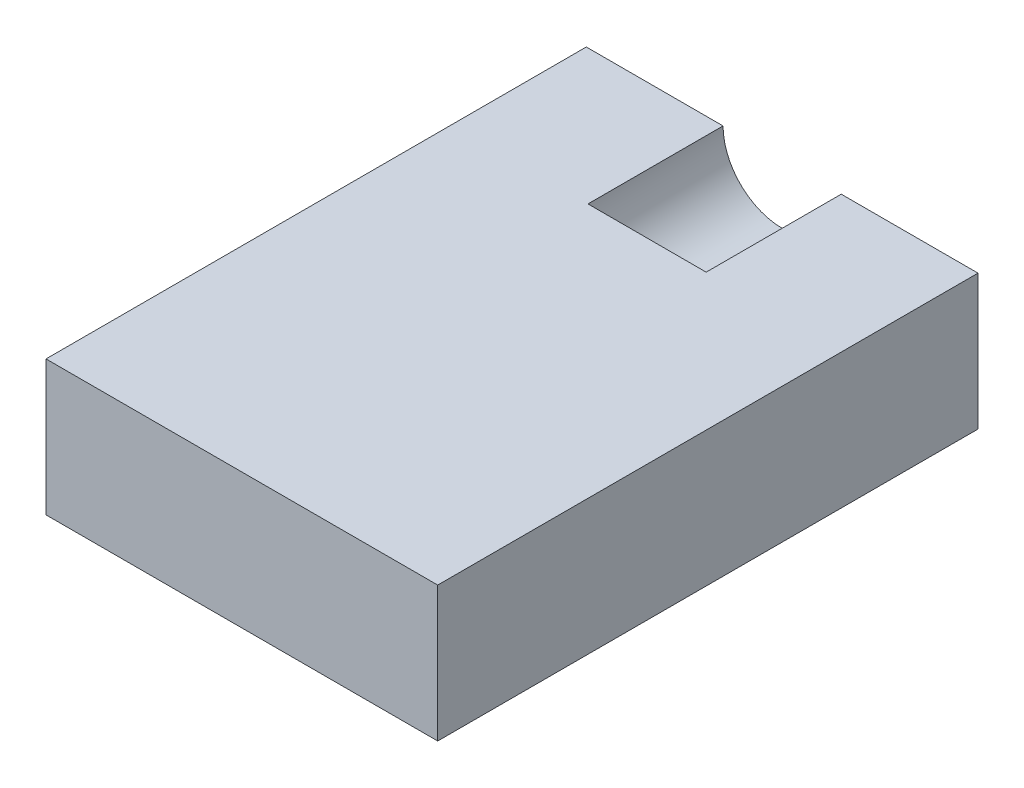
ISO-10303-21;
HEADER;
FILE_DESCRIPTION(('STEP AP214'),'2;1');
FILE_NAME('part.step','',(''),(''),'','','');
FILE_SCHEMA(('AUTOMOTIVE_DESIGN { 1 0 10303 214 1 1 1 1 }'));
ENDSEC;
DATA;
#1=APPLICATION_CONTEXT('core data for automotive mechanical design processes');
#2=APPLICATION_PROTOCOL_DEFINITION('international standard','automotive_design',2000,#1);
#3=PRODUCT_CONTEXT('',#1,'mechanical');
#4=PRODUCT('Part','Part','',(#3));
#5=PRODUCT_RELATED_PRODUCT_CATEGORY('part','',(#4));
#6=PRODUCT_DEFINITION_FORMATION('','',#4);
#7=PRODUCT_DEFINITION_CONTEXT('part definition',#1,'design');
#8=PRODUCT_DEFINITION('design','',#6,#7);
#9=PRODUCT_DEFINITION_SHAPE('','',#8);
#10=(LENGTH_UNIT() NAMED_UNIT(*) SI_UNIT(.MILLI.,.METRE.));
#11=(NAMED_UNIT(*) PLANE_ANGLE_UNIT() SI_UNIT($,.RADIAN.));
#12=(NAMED_UNIT(*) SI_UNIT($,.STERADIAN.) SOLID_ANGLE_UNIT());
#13=UNCERTAINTY_MEASURE_WITH_UNIT(LENGTH_MEASURE(1.E-05),#10,'distance_accuracy_value','');
#14=(GEOMETRIC_REPRESENTATION_CONTEXT(3) GLOBAL_UNCERTAINTY_ASSIGNED_CONTEXT((#13)) GLOBAL_UNIT_ASSIGNED_CONTEXT((#10,
#11,#12)) REPRESENTATION_CONTEXT('',''));
#15=CARTESIAN_POINT('',(0.,0.,0.));
#16=DIRECTION('',(0.,0.,1.));
#17=DIRECTION('',(1.,0.,0.));
#18=AXIS2_PLACEMENT_3D('',#15,#16,#17);
#19=CARTESIAN_POINT('',(-18.415,6.35,50.8));
#20=DIRECTION('',(0.,-1.,0.));
#21=DIRECTION('',(0.,0.,-1.));
#22=AXIS2_PLACEMENT_3D('',#19,#20,#21);
#23=PLANE('',#22);
#24=DIRECTION('',(0.,0.,-1.));
#25=VECTOR('',#24,1.);
#26=CARTESIAN_POINT('',(-5.55625,6.35,12.7));
#27=LINE('',#26,#25);
#28=CARTESIAN_POINT('',(-5.55625,6.35,0.));
#29=VERTEX_POINT('',#28);
#30=CARTESIAN_POINT('',(-5.55625,6.35,12.7));
#31=VERTEX_POINT('',#30);
#32=EDGE_CURVE('E100',#29,#31,#27,.F.);
#33=ORIENTED_EDGE('',*,*,#32,.F.);
#34=DIRECTION('',(-1.,0.,0.));
#35=VECTOR('',#34,1.);
#36=CARTESIAN_POINT('',(-18.415,6.35,0.));
#37=LINE('',#36,#35);
#38=CARTESIAN_POINT('',(-18.415,6.35,0.));
#39=VERTEX_POINT('',#38);
#40=EDGE_CURVE('E117',#29,#39,#37,.T.);
#41=ORIENTED_EDGE('',*,*,#40,.T.);
#42=DIRECTION('',(0.,0.,-1.));
#43=VECTOR('',#42,1.);
#44=CARTESIAN_POINT('',(-18.415,6.35,50.8));
#45=LINE('',#44,#43);
#46=CARTESIAN_POINT('',(-18.415,6.35,50.8));
#47=VERTEX_POINT('',#46);
#48=EDGE_CURVE('E125',#47,#39,#45,.T.);
#49=ORIENTED_EDGE('',*,*,#48,.F.);
#50=DIRECTION('',(-1.,0.,0.));
#51=VECTOR('',#50,1.);
#52=CARTESIAN_POINT('',(-18.415,6.35,50.8));
#53=LINE('',#52,#51);
#54=CARTESIAN_POINT('',(18.415,6.35,50.8));
#55=VERTEX_POINT('',#54);
#56=EDGE_CURVE('E86',#55,#47,#53,.T.);
#57=ORIENTED_EDGE('',*,*,#56,.F.);
#58=DIRECTION('',(0.,0.,-1.));
#59=VECTOR('',#58,1.);
#60=CARTESIAN_POINT('',(18.415,6.35,50.8));
#61=LINE('',#60,#59);
#62=CARTESIAN_POINT('',(18.415,6.35,0.));
#63=VERTEX_POINT('',#62);
#64=EDGE_CURVE('E128',#55,#63,#61,.T.);
#65=ORIENTED_EDGE('',*,*,#64,.T.);
#66=CARTESIAN_POINT('',(5.55625,6.35,0.));
#67=VERTEX_POINT('',#66);
#68=EDGE_CURVE('E103',#63,#67,#37,.T.);
#69=ORIENTED_EDGE('',*,*,#68,.T.);
#70=DIRECTION('',(0.,0.,-1.));
#71=VECTOR('',#70,1.);
#72=CARTESIAN_POINT('',(5.55625,6.35,12.7));
#73=LINE('',#72,#71);
#74=CARTESIAN_POINT('',(5.55625,6.35,12.7));
#75=VERTEX_POINT('',#74);
#76=EDGE_CURVE('E48',#75,#67,#73,.T.);
#77=ORIENTED_EDGE('',*,*,#76,.F.);
#78=DIRECTION('',(-1.,0.,0.));
#79=VECTOR('',#78,1.);
#80=CARTESIAN_POINT('',(-18.415,6.35,12.7));
#81=LINE('',#80,#79);
#82=EDGE_CURVE('E11',#75,#31,#81,.T.);
#83=ORIENTED_EDGE('',*,*,#82,.T.);
#84=EDGE_LOOP('',(#33,#41,#49,#57,#65,#69,#77,#83));
#85=FACE_BOUND('',#84,.T.);
#86=ADVANCED_FACE('F33',(#85),#23,.F.);
#87=CARTESIAN_POINT('',(0.,0.,0.));
#88=DIRECTION('',(0.,0.,1.));
#89=DIRECTION('',(1.,0.,0.));
#90=AXIS2_PLACEMENT_3D('',#87,#88,#89);
#91=PLANE('',#90);
#92=CARTESIAN_POINT('',(0.,6.35,0.));
#93=DIRECTION('',(0.,0.,1.));
#94=DIRECTION('',(1.,0.,0.));
#95=AXIS2_PLACEMENT_3D('',#92,#93,#94);
#96=CIRCLE('',#95,5.55625);
#97=EDGE_CURVE('E41',#67,#29,#96,.F.);
#98=ORIENTED_EDGE('',*,*,#97,.F.);
#99=ORIENTED_EDGE('',*,*,#68,.F.);
#100=DIRECTION('',(0.,1.,0.));
#101=VECTOR('',#100,1.);
#102=CARTESIAN_POINT('',(18.415,6.35,0.));
#103=LINE('',#102,#101);
#104=CARTESIAN_POINT('',(18.415,-6.35,0.));
#105=VERTEX_POINT('',#104);
#106=EDGE_CURVE('E105',#105,#63,#103,.T.);
#107=ORIENTED_EDGE('',*,*,#106,.F.);
#108=DIRECTION('',(1.,0.,0.));
#109=VECTOR('',#108,1.);
#110=CARTESIAN_POINT('',(-18.415,-6.35,0.));
#111=LINE('',#110,#109);
#112=CARTESIAN_POINT('',(-18.415,-6.35,0.));
#113=VERTEX_POINT('',#112);
#114=EDGE_CURVE('E78',#113,#105,#111,.T.);
#115=ORIENTED_EDGE('',*,*,#114,.F.);
#116=DIRECTION('',(0.,-1.,0.));
#117=VECTOR('',#116,1.);
#118=CARTESIAN_POINT('',(-18.415,6.35,0.));
#119=LINE('',#118,#117);
#120=EDGE_CURVE('E119',#39,#113,#119,.T.);
#121=ORIENTED_EDGE('',*,*,#120,.F.);
#122=ORIENTED_EDGE('',*,*,#40,.F.);
#123=EDGE_LOOP('',(#98,#99,#107,#115,#121,#122));
#124=FACE_BOUND('',#123,.T.);
#125=ADVANCED_FACE('F132',(#124),#91,.F.);
#126=CARTESIAN_POINT('',(18.415,6.35,50.8));
#127=DIRECTION('',(-1.,0.,0.));
#128=DIRECTION('',(0.,0.,1.));
#129=AXIS2_PLACEMENT_3D('',#126,#127,#128);
#130=PLANE('',#129);
#131=ORIENTED_EDGE('',*,*,#106,.T.);
#132=ORIENTED_EDGE('',*,*,#64,.F.);
#133=DIRECTION('',(0.,1.,0.));
#134=VECTOR('',#133,1.);
#135=CARTESIAN_POINT('',(18.415,6.35,50.8));
#136=LINE('',#135,#134);
#137=CARTESIAN_POINT('',(18.415,-6.35,50.8));
#138=VERTEX_POINT('',#137);
#139=EDGE_CURVE('E108',#138,#55,#136,.T.);
#140=ORIENTED_EDGE('',*,*,#139,.F.);
#141=DIRECTION('',(0.,0.,-1.));
#142=VECTOR('',#141,1.);
#143=CARTESIAN_POINT('',(18.415,-6.35,50.8));
#144=LINE('',#143,#142);
#145=EDGE_CURVE('E114',#138,#105,#144,.T.);
#146=ORIENTED_EDGE('',*,*,#145,.T.);
#147=EDGE_LOOP('',(#131,#132,#140,#146));
#148=FACE_BOUND('',#147,.T.);
#149=ADVANCED_FACE('F35',(#148),#130,.F.);
#150=CARTESIAN_POINT('',(-18.415,6.35,50.8));
#151=DIRECTION('',(1.,0.,0.));
#152=DIRECTION('',(0.,0.,-1.));
#153=AXIS2_PLACEMENT_3D('',#150,#151,#152);
#154=PLANE('',#153);
#155=ORIENTED_EDGE('',*,*,#120,.T.);
#156=DIRECTION('',(0.,0.,-1.));
#157=VECTOR('',#156,1.);
#158=CARTESIAN_POINT('',(-18.415,-6.35,50.8));
#159=LINE('',#158,#157);
#160=CARTESIAN_POINT('',(-18.415,-6.35,50.8));
#161=VERTEX_POINT('',#160);
#162=EDGE_CURVE('E123',#161,#113,#159,.T.);
#163=ORIENTED_EDGE('',*,*,#162,.F.);
#164=DIRECTION('',(0.,-1.,0.));
#165=VECTOR('',#164,1.);
#166=CARTESIAN_POINT('',(-18.415,6.35,50.8));
#167=LINE('',#166,#165);
#168=EDGE_CURVE('E111',#47,#161,#167,.T.);
#169=ORIENTED_EDGE('',*,*,#168,.F.);
#170=ORIENTED_EDGE('',*,*,#48,.T.);
#171=EDGE_LOOP('',(#155,#163,#169,#170));
#172=FACE_BOUND('',#171,.T.);
#173=ADVANCED_FACE('F136',(#172),#154,.F.);
#174=CARTESIAN_POINT('',(-18.415,-6.35,50.8));
#175=DIRECTION('',(0.,1.,0.));
#176=DIRECTION('',(0.,0.,1.));
#177=AXIS2_PLACEMENT_3D('',#174,#175,#176);
#178=PLANE('',#177);
#179=ORIENTED_EDGE('',*,*,#114,.T.);
#180=ORIENTED_EDGE('',*,*,#145,.F.);
#181=DIRECTION('',(1.,0.,0.));
#182=VECTOR('',#181,1.);
#183=CARTESIAN_POINT('',(-18.415,-6.35,50.8));
#184=LINE('',#183,#182);
#185=EDGE_CURVE('E57',#161,#138,#184,.T.);
#186=ORIENTED_EDGE('',*,*,#185,.F.);
#187=ORIENTED_EDGE('',*,*,#162,.T.);
#188=EDGE_LOOP('',(#179,#180,#186,#187));
#189=FACE_BOUND('',#188,.T.);
#190=ADVANCED_FACE('F138',(#189),#178,.F.);
#191=CARTESIAN_POINT('',(0.,0.,50.8));
#192=DIRECTION('',(0.,0.,1.));
#193=DIRECTION('',(1.,0.,0.));
#194=AXIS2_PLACEMENT_3D('',#191,#192,#193);
#195=PLANE('',#194);
#196=ORIENTED_EDGE('',*,*,#139,.T.);
#197=ORIENTED_EDGE('',*,*,#56,.T.);
#198=ORIENTED_EDGE('',*,*,#168,.T.);
#199=ORIENTED_EDGE('',*,*,#185,.T.);
#200=EDGE_LOOP('',(#196,#197,#198,#199));
#201=FACE_BOUND('',#200,.T.);
#202=ADVANCED_FACE('F142',(#201),#195,.T.);
#203=CARTESIAN_POINT('',(0.,6.35,12.7));
#204=DIRECTION('',(0.,0.,1.));
#205=DIRECTION('',(1.,0.,0.));
#206=AXIS2_PLACEMENT_3D('',#203,#204,#205);
#207=PLANE('',#206);
#208=CARTESIAN_POINT('',(0.,6.35,12.7));
#209=DIRECTION('',(0.,0.,1.));
#210=DIRECTION('',(1.,0.,0.));
#211=AXIS2_PLACEMENT_3D('',#208,#209,#210);
#212=CIRCLE('',#211,5.55625);
#213=EDGE_CURVE('E97',#31,#75,#212,.T.);
#214=ORIENTED_EDGE('',*,*,#213,.F.);
#215=ORIENTED_EDGE('',*,*,#82,.F.);
#216=EDGE_LOOP('',(#214,#215));
#217=FACE_BOUND('',#216,.T.);
#218=ADVANCED_FACE('F96',(#217),#207,.F.);
#219=CARTESIAN_POINT('',(0.,6.35,12.7));
#220=DIRECTION('',(0.,0.,-1.));
#221=DIRECTION('',(-1.,0.,0.));
#222=AXIS2_PLACEMENT_3D('',#219,#220,#221);
#223=CYLINDRICAL_SURFACE('',#222,5.55625);
#224=ORIENTED_EDGE('',*,*,#32,.T.);
#225=ORIENTED_EDGE('',*,*,#213,.T.);
#226=ORIENTED_EDGE('',*,*,#76,.T.);
#227=ORIENTED_EDGE('',*,*,#97,.T.);
#228=EDGE_LOOP('',(#224,#225,#226,#227));
#229=FACE_BOUND('',#228,.T.);
#230=ADVANCED_FACE('F99',(#229),#223,.F.);
#231=CLOSED_SHELL('',(#86,#125,#149,#173,#190,#202,#218,#230));
#232=MANIFOLD_SOLID_BREP('B2',#231);
#233=ADVANCED_BREP_SHAPE_REPRESENTATION('',(#18,#232),#14);
#234=SHAPE_DEFINITION_REPRESENTATION(#9,#233);
ENDSEC;
END-ISO-10303-21;
